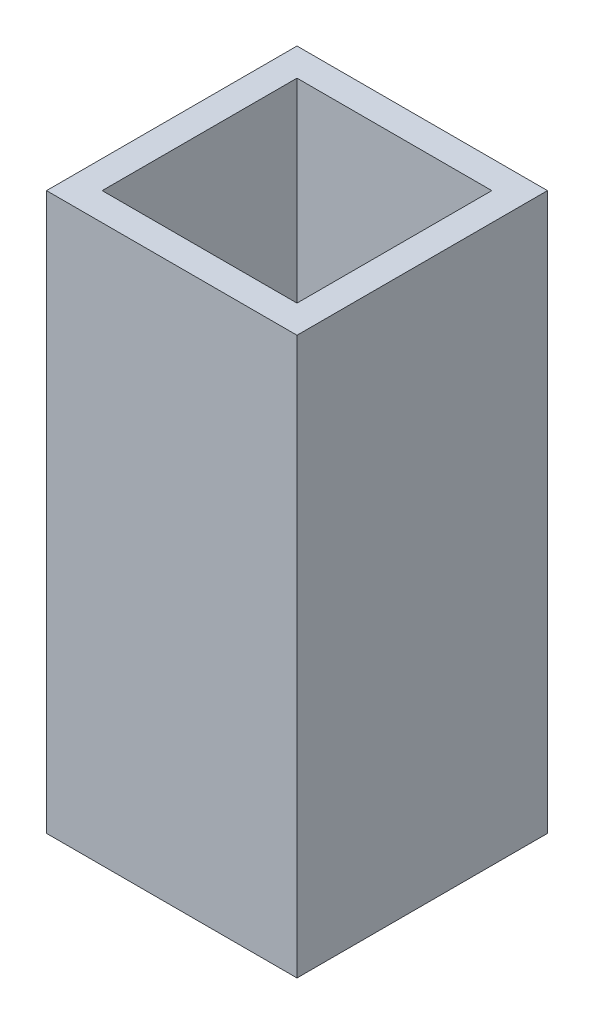
ISO-10303-21;
HEADER;
FILE_DESCRIPTION(('STEP AP214'),'2;1');
FILE_NAME('part.step','',(''),(''),'','','');
FILE_SCHEMA(('AUTOMOTIVE_DESIGN { 1 0 10303 214 1 1 1 1 }'));
ENDSEC;
DATA;
#1=APPLICATION_CONTEXT('core data for automotive mechanical design processes');
#2=APPLICATION_PROTOCOL_DEFINITION('international standard','automotive_design',2000,#1);
#3=PRODUCT_CONTEXT('',#1,'mechanical');
#4=PRODUCT('Part','Part','',(#3));
#5=PRODUCT_RELATED_PRODUCT_CATEGORY('part','',(#4));
#6=PRODUCT_DEFINITION_FORMATION('','',#4);
#7=PRODUCT_DEFINITION_CONTEXT('part definition',#1,'design');
#8=PRODUCT_DEFINITION('design','',#6,#7);
#9=PRODUCT_DEFINITION_SHAPE('','',#8);
#10=(LENGTH_UNIT() NAMED_UNIT(*) SI_UNIT(.MILLI.,.METRE.));
#11=(NAMED_UNIT(*) PLANE_ANGLE_UNIT() SI_UNIT($,.RADIAN.));
#12=(NAMED_UNIT(*) SI_UNIT($,.STERADIAN.) SOLID_ANGLE_UNIT());
#13=UNCERTAINTY_MEASURE_WITH_UNIT(LENGTH_MEASURE(1.E-05),#10,'distance_accuracy_value','');
#14=(GEOMETRIC_REPRESENTATION_CONTEXT(3) GLOBAL_UNCERTAINTY_ASSIGNED_CONTEXT((#13)) GLOBAL_UNIT_ASSIGNED_CONTEXT((#10,
#11,#12)) REPRESENTATION_CONTEXT('',''));
#15=CARTESIAN_POINT('',(0.,0.,0.));
#16=DIRECTION('',(0.,0.,1.));
#17=DIRECTION('',(1.,0.,0.));
#18=AXIS2_PLACEMENT_3D('',#15,#16,#17);
#19=CARTESIAN_POINT('',(0.,10.,0.));
#20=DIRECTION('',(0.,1.,0.));
#21=DIRECTION('',(0.,0.,1.));
#22=AXIS2_PLACEMENT_3D('',#19,#20,#21);
#23=PLANE('',#22);
#24=DIRECTION('',(0.,0.,-1.));
#25=VECTOR('',#24,1.);
#26=CARTESIAN_POINT('',(2.25,10.,-2.25));
#27=LINE('',#26,#25);
#28=CARTESIAN_POINT('',(2.25,10.,2.25));
#29=VERTEX_POINT('',#28);
#30=CARTESIAN_POINT('',(2.25,10.,-2.25));
#31=VERTEX_POINT('',#30);
#32=EDGE_CURVE('E153',#29,#31,#27,.T.);
#33=ORIENTED_EDGE('',*,*,#32,.T.);
#34=DIRECTION('',(-1.,0.,0.));
#35=VECTOR('',#34,1.);
#36=CARTESIAN_POINT('',(-2.25,10.,-2.25));
#37=LINE('',#36,#35);
#38=CARTESIAN_POINT('',(-2.25,10.,-2.25));
#39=VERTEX_POINT('',#38);
#40=EDGE_CURVE('E157',#31,#39,#37,.T.);
#41=ORIENTED_EDGE('',*,*,#40,.T.);
#42=DIRECTION('',(0.,0.,1.));
#43=VECTOR('',#42,1.);
#44=CARTESIAN_POINT('',(-2.25,10.,-2.25));
#45=LINE('',#44,#43);
#46=CARTESIAN_POINT('',(-2.25,10.,2.25));
#47=VERTEX_POINT('',#46);
#48=EDGE_CURVE('E161',#39,#47,#45,.T.);
#49=ORIENTED_EDGE('',*,*,#48,.T.);
#50=DIRECTION('',(1.,0.,0.));
#51=VECTOR('',#50,1.);
#52=CARTESIAN_POINT('',(-2.25,10.,2.25));
#53=LINE('',#52,#51);
#54=EDGE_CURVE('E164',#47,#29,#53,.T.);
#55=ORIENTED_EDGE('',*,*,#54,.T.);
#56=EDGE_LOOP('',(#33,#41,#49,#55));
#57=FACE_BOUND('',#56,.T.);
#58=DIRECTION('',(-1.,0.,0.));
#59=VECTOR('',#58,1.);
#60=CARTESIAN_POINT('',(-1.75,10.,-1.75));
#61=LINE('',#60,#59);
#62=CARTESIAN_POINT('',(1.75,10.,-1.75));
#63=VERTEX_POINT('',#62);
#64=CARTESIAN_POINT('',(-1.75,10.,-1.75));
#65=VERTEX_POINT('',#64);
#66=EDGE_CURVE('E114',#63,#65,#61,.T.);
#67=ORIENTED_EDGE('',*,*,#66,.F.);
#68=DIRECTION('',(0.,0.,-1.));
#69=VECTOR('',#68,1.);
#70=CARTESIAN_POINT('',(1.75,10.,-1.75));
#71=LINE('',#70,#69);
#72=CARTESIAN_POINT('',(1.75,10.,1.75));
#73=VERTEX_POINT('',#72);
#74=EDGE_CURVE('E105',#73,#63,#71,.T.);
#75=ORIENTED_EDGE('',*,*,#74,.F.);
#76=DIRECTION('',(1.,0.,0.));
#77=VECTOR('',#76,1.);
#78=CARTESIAN_POINT('',(-1.75,10.,1.75));
#79=LINE('',#78,#77);
#80=CARTESIAN_POINT('',(-1.75,10.,1.75));
#81=VERTEX_POINT('',#80);
#82=EDGE_CURVE('E131',#81,#73,#79,.T.);
#83=ORIENTED_EDGE('',*,*,#82,.F.);
#84=DIRECTION('',(0.,0.,1.));
#85=VECTOR('',#84,1.);
#86=CARTESIAN_POINT('',(-1.75,10.,-1.75));
#87=LINE('',#86,#85);
#88=EDGE_CURVE('E127',#65,#81,#87,.T.);
#89=ORIENTED_EDGE('',*,*,#88,.F.);
#90=EDGE_LOOP('',(#67,#75,#83,#89));
#91=FACE_BOUND('',#90,.T.);
#92=ADVANCED_FACE('F39',(#57,#91),#23,.T.);
#93=CARTESIAN_POINT('',(0.,0.,0.));
#94=DIRECTION('',(0.,1.,0.));
#95=DIRECTION('',(0.,0.,1.));
#96=AXIS2_PLACEMENT_3D('',#93,#94,#95);
#97=PLANE('',#96);
#98=DIRECTION('',(0.,0.,-1.));
#99=VECTOR('',#98,1.);
#100=CARTESIAN_POINT('',(2.25,0.,-2.25));
#101=LINE('',#100,#99);
#102=CARTESIAN_POINT('',(2.25,0.,2.25));
#103=VERTEX_POINT('',#102);
#104=CARTESIAN_POINT('',(2.25,0.,-2.25));
#105=VERTEX_POINT('',#104);
#106=EDGE_CURVE('E123',#103,#105,#101,.T.);
#107=ORIENTED_EDGE('',*,*,#106,.F.);
#108=DIRECTION('',(1.,0.,0.));
#109=VECTOR('',#108,1.);
#110=CARTESIAN_POINT('',(-2.25,0.,2.25));
#111=LINE('',#110,#109);
#112=CARTESIAN_POINT('',(-2.25,0.,2.25));
#113=VERTEX_POINT('',#112);
#114=EDGE_CURVE('E158',#113,#103,#111,.T.);
#115=ORIENTED_EDGE('',*,*,#114,.F.);
#116=DIRECTION('',(0.,0.,1.));
#117=VECTOR('',#116,1.);
#118=CARTESIAN_POINT('',(-2.25,0.,-2.25));
#119=LINE('',#118,#117);
#120=CARTESIAN_POINT('',(-2.25,0.,-2.25));
#121=VERTEX_POINT('',#120);
#122=EDGE_CURVE('E174',#121,#113,#119,.T.);
#123=ORIENTED_EDGE('',*,*,#122,.F.);
#124=DIRECTION('',(-1.,0.,0.));
#125=VECTOR('',#124,1.);
#126=CARTESIAN_POINT('',(-2.25,0.,-2.25));
#127=LINE('',#126,#125);
#128=EDGE_CURVE('E171',#105,#121,#127,.T.);
#129=ORIENTED_EDGE('',*,*,#128,.F.);
#130=EDGE_LOOP('',(#107,#115,#123,#129));
#131=FACE_BOUND('',#130,.T.);
#132=DIRECTION('',(0.,0.,-1.));
#133=VECTOR('',#132,1.);
#134=CARTESIAN_POINT('',(1.75,0.,-1.75));
#135=LINE('',#134,#133);
#136=CARTESIAN_POINT('',(1.75,0.,1.75));
#137=VERTEX_POINT('',#136);
#138=CARTESIAN_POINT('',(1.75,0.,-1.75));
#139=VERTEX_POINT('',#138);
#140=EDGE_CURVE('E63',#137,#139,#135,.T.);
#141=ORIENTED_EDGE('',*,*,#140,.T.);
#142=DIRECTION('',(-1.,0.,0.));
#143=VECTOR('',#142,1.);
#144=CARTESIAN_POINT('',(-1.75,0.,-1.75));
#145=LINE('',#144,#143);
#146=CARTESIAN_POINT('',(-1.75,0.,-1.75));
#147=VERTEX_POINT('',#146);
#148=EDGE_CURVE('E121',#139,#147,#145,.T.);
#149=ORIENTED_EDGE('',*,*,#148,.T.);
#150=DIRECTION('',(0.,0.,1.));
#151=VECTOR('',#150,1.);
#152=CARTESIAN_POINT('',(-1.75,0.,-1.75));
#153=LINE('',#152,#151);
#154=CARTESIAN_POINT('',(-1.75,0.,1.75));
#155=VERTEX_POINT('',#154);
#156=EDGE_CURVE('E140',#147,#155,#153,.T.);
#157=ORIENTED_EDGE('',*,*,#156,.T.);
#158=DIRECTION('',(1.,0.,0.));
#159=VECTOR('',#158,1.);
#160=CARTESIAN_POINT('',(-1.75,0.,1.75));
#161=LINE('',#160,#159);
#162=EDGE_CURVE('E115',#155,#137,#161,.T.);
#163=ORIENTED_EDGE('',*,*,#162,.T.);
#164=EDGE_LOOP('',(#141,#149,#157,#163));
#165=FACE_BOUND('',#164,.T.);
#166=ADVANCED_FACE('F197',(#131,#165),#97,.F.);
#167=CARTESIAN_POINT('',(2.25,10.,-2.25));
#168=DIRECTION('',(-1.,0.,0.));
#169=DIRECTION('',(0.,0.,1.));
#170=AXIS2_PLACEMENT_3D('',#167,#168,#169);
#171=PLANE('',#170);
#172=ORIENTED_EDGE('',*,*,#106,.T.);
#173=DIRECTION('',(0.,-1.,0.));
#174=VECTOR('',#173,1.);
#175=CARTESIAN_POINT('',(2.25,10.,-2.25));
#176=LINE('',#175,#174);
#177=EDGE_CURVE('E11',#31,#105,#176,.T.);
#178=ORIENTED_EDGE('',*,*,#177,.F.);
#179=ORIENTED_EDGE('',*,*,#32,.F.);
#180=DIRECTION('',(0.,-1.,0.));
#181=VECTOR('',#180,1.);
#182=CARTESIAN_POINT('',(2.25,10.,2.25));
#183=LINE('',#182,#181);
#184=EDGE_CURVE('E167',#29,#103,#183,.T.);
#185=ORIENTED_EDGE('',*,*,#184,.T.);
#186=EDGE_LOOP('',(#172,#178,#179,#185));
#187=FACE_BOUND('',#186,.T.);
#188=ADVANCED_FACE('F41',(#187),#171,.F.);
#189=CARTESIAN_POINT('',(-2.25,10.,-2.25));
#190=DIRECTION('',(0.,0.,1.));
#191=DIRECTION('',(1.,0.,0.));
#192=AXIS2_PLACEMENT_3D('',#189,#190,#191);
#193=PLANE('',#192);
#194=ORIENTED_EDGE('',*,*,#128,.T.);
#195=DIRECTION('',(0.,-1.,0.));
#196=VECTOR('',#195,1.);
#197=CARTESIAN_POINT('',(-2.25,10.,-2.25));
#198=LINE('',#197,#196);
#199=EDGE_CURVE('E48',#39,#121,#198,.T.);
#200=ORIENTED_EDGE('',*,*,#199,.F.);
#201=ORIENTED_EDGE('',*,*,#40,.F.);
#202=ORIENTED_EDGE('',*,*,#177,.T.);
#203=EDGE_LOOP('',(#194,#200,#201,#202));
#204=FACE_BOUND('',#203,.T.);
#205=ADVANCED_FACE('F207',(#204),#193,.F.);
#206=CARTESIAN_POINT('',(-2.25,10.,-2.25));
#207=DIRECTION('',(1.,0.,0.));
#208=DIRECTION('',(0.,0.,-1.));
#209=AXIS2_PLACEMENT_3D('',#206,#207,#208);
#210=PLANE('',#209);
#211=ORIENTED_EDGE('',*,*,#122,.T.);
#212=DIRECTION('',(0.,-1.,0.));
#213=VECTOR('',#212,1.);
#214=CARTESIAN_POINT('',(-2.25,10.,2.25));
#215=LINE('',#214,#213);
#216=EDGE_CURVE('E182',#47,#113,#215,.T.);
#217=ORIENTED_EDGE('',*,*,#216,.F.);
#218=ORIENTED_EDGE('',*,*,#48,.F.);
#219=ORIENTED_EDGE('',*,*,#199,.T.);
#220=EDGE_LOOP('',(#211,#217,#218,#219));
#221=FACE_BOUND('',#220,.T.);
#222=ADVANCED_FACE('F191',(#221),#210,.F.);
#223=CARTESIAN_POINT('',(-2.25,10.,2.25));
#224=DIRECTION('',(0.,0.,-1.));
#225=DIRECTION('',(-1.,0.,0.));
#226=AXIS2_PLACEMENT_3D('',#223,#224,#225);
#227=PLANE('',#226);
#228=ORIENTED_EDGE('',*,*,#114,.T.);
#229=ORIENTED_EDGE('',*,*,#184,.F.);
#230=ORIENTED_EDGE('',*,*,#54,.F.);
#231=ORIENTED_EDGE('',*,*,#216,.T.);
#232=EDGE_LOOP('',(#228,#229,#230,#231));
#233=FACE_BOUND('',#232,.T.);
#234=ADVANCED_FACE('F201',(#233),#227,.F.);
#235=CARTESIAN_POINT('',(1.75,10.,-1.75));
#236=DIRECTION('',(-1.,0.,0.));
#237=DIRECTION('',(0.,0.,1.));
#238=AXIS2_PLACEMENT_3D('',#235,#236,#237);
#239=PLANE('',#238);
#240=ORIENTED_EDGE('',*,*,#140,.F.);
#241=DIRECTION('',(0.,-1.,0.));
#242=VECTOR('',#241,1.);
#243=CARTESIAN_POINT('',(1.75,10.,1.75));
#244=LINE('',#243,#242);
#245=EDGE_CURVE('E109',#73,#137,#244,.T.);
#246=ORIENTED_EDGE('',*,*,#245,.F.);
#247=ORIENTED_EDGE('',*,*,#74,.T.);
#248=DIRECTION('',(0.,-1.,0.));
#249=VECTOR('',#248,1.);
#250=CARTESIAN_POINT('',(1.75,10.,-1.75));
#251=LINE('',#250,#249);
#252=EDGE_CURVE('E108',#63,#139,#251,.T.);
#253=ORIENTED_EDGE('',*,*,#252,.T.);
#254=EDGE_LOOP('',(#240,#246,#247,#253));
#255=FACE_BOUND('',#254,.T.);
#256=ADVANCED_FACE('F107',(#255),#239,.T.);
#257=CARTESIAN_POINT('',(-1.75,10.,-1.75));
#258=DIRECTION('',(0.,0.,1.));
#259=DIRECTION('',(1.,0.,0.));
#260=AXIS2_PLACEMENT_3D('',#257,#258,#259);
#261=PLANE('',#260);
#262=ORIENTED_EDGE('',*,*,#148,.F.);
#263=ORIENTED_EDGE('',*,*,#252,.F.);
#264=ORIENTED_EDGE('',*,*,#66,.T.);
#265=DIRECTION('',(0.,-1.,0.));
#266=VECTOR('',#265,1.);
#267=CARTESIAN_POINT('',(-1.75,10.,-1.75));
#268=LINE('',#267,#266);
#269=EDGE_CURVE('E124',#65,#147,#268,.T.);
#270=ORIENTED_EDGE('',*,*,#269,.T.);
#271=EDGE_LOOP('',(#262,#263,#264,#270));
#272=FACE_BOUND('',#271,.T.);
#273=ADVANCED_FACE('F118',(#272),#261,.T.);
#274=CARTESIAN_POINT('',(-1.75,10.,-1.75));
#275=DIRECTION('',(1.,0.,0.));
#276=DIRECTION('',(0.,0.,-1.));
#277=AXIS2_PLACEMENT_3D('',#274,#275,#276);
#278=PLANE('',#277);
#279=ORIENTED_EDGE('',*,*,#156,.F.);
#280=ORIENTED_EDGE('',*,*,#269,.F.);
#281=ORIENTED_EDGE('',*,*,#88,.T.);
#282=DIRECTION('',(0.,-1.,0.));
#283=VECTOR('',#282,1.);
#284=CARTESIAN_POINT('',(-1.75,10.,1.75));
#285=LINE('',#284,#283);
#286=EDGE_CURVE('E55',#81,#155,#285,.T.);
#287=ORIENTED_EDGE('',*,*,#286,.T.);
#288=EDGE_LOOP('',(#279,#280,#281,#287));
#289=FACE_BOUND('',#288,.T.);
#290=ADVANCED_FACE('F230',(#289),#278,.T.);
#291=CARTESIAN_POINT('',(-1.75,10.,1.75));
#292=DIRECTION('',(0.,0.,-1.));
#293=DIRECTION('',(-1.,0.,0.));
#294=AXIS2_PLACEMENT_3D('',#291,#292,#293);
#295=PLANE('',#294);
#296=ORIENTED_EDGE('',*,*,#162,.F.);
#297=ORIENTED_EDGE('',*,*,#286,.F.);
#298=ORIENTED_EDGE('',*,*,#82,.T.);
#299=ORIENTED_EDGE('',*,*,#245,.T.);
#300=EDGE_LOOP('',(#296,#297,#298,#299));
#301=FACE_BOUND('',#300,.T.);
#302=ADVANCED_FACE('F234',(#301),#295,.T.);
#303=CLOSED_SHELL('',(#92,#166,#188,#205,#222,#234,#256,#273,#290,#302));
#304=MANIFOLD_SOLID_BREP('B2',#303);
#305=ADVANCED_BREP_SHAPE_REPRESENTATION('',(#18,#304),#14);
#306=SHAPE_DEFINITION_REPRESENTATION(#9,#305);
ENDSEC;
END-ISO-10303-21;
